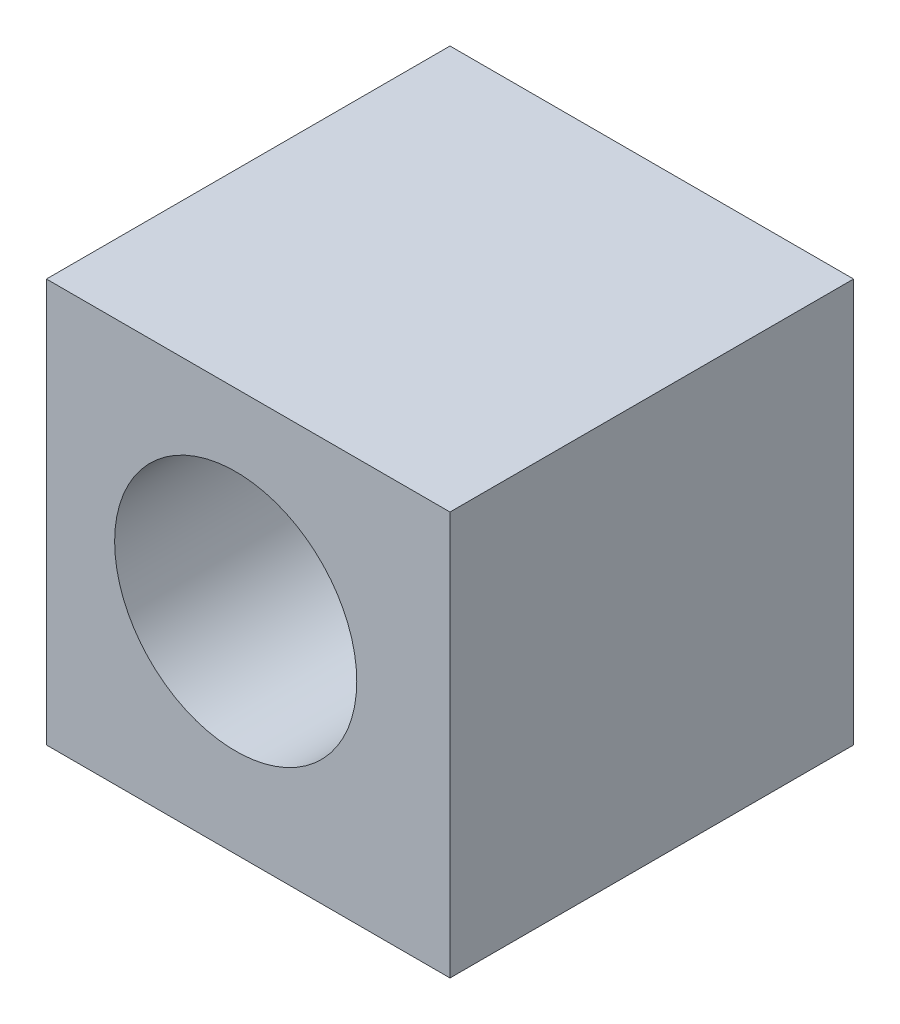
ISO-10303-21;
HEADER;
FILE_DESCRIPTION(('STEP AP214'),'2;1');
FILE_NAME('part.step','',(''),(''),'','','');
FILE_SCHEMA(('AUTOMOTIVE_DESIGN { 1 0 10303 214 1 1 1 1 }'));
ENDSEC;
DATA;
#1=APPLICATION_CONTEXT('core data for automotive mechanical design processes');
#2=APPLICATION_PROTOCOL_DEFINITION('international standard','automotive_design',2000,#1);
#3=PRODUCT_CONTEXT('',#1,'mechanical');
#4=PRODUCT('Part','Part','',(#3));
#5=PRODUCT_RELATED_PRODUCT_CATEGORY('part','',(#4));
#6=PRODUCT_DEFINITION_FORMATION('','',#4);
#7=PRODUCT_DEFINITION_CONTEXT('part definition',#1,'design');
#8=PRODUCT_DEFINITION('design','',#6,#7);
#9=PRODUCT_DEFINITION_SHAPE('','',#8);
#10=(LENGTH_UNIT() NAMED_UNIT(*) SI_UNIT(.MILLI.,.METRE.));
#11=(NAMED_UNIT(*) PLANE_ANGLE_UNIT() SI_UNIT($,.RADIAN.));
#12=(NAMED_UNIT(*) SI_UNIT($,.STERADIAN.) SOLID_ANGLE_UNIT());
#13=UNCERTAINTY_MEASURE_WITH_UNIT(LENGTH_MEASURE(1.E-05),#10,'distance_accuracy_value','');
#14=(GEOMETRIC_REPRESENTATION_CONTEXT(3) GLOBAL_UNCERTAINTY_ASSIGNED_CONTEXT((#13)) GLOBAL_UNIT_ASSIGNED_CONTEXT((#10,
#11,#12)) REPRESENTATION_CONTEXT('',''));
#15=CARTESIAN_POINT('',(0.,0.,0.));
#16=DIRECTION('',(0.,0.,1.));
#17=DIRECTION('',(1.,0.,0.));
#18=AXIS2_PLACEMENT_3D('',#15,#16,#17);
#19=CARTESIAN_POINT('',(0.,0.,50.));
#20=DIRECTION('',(1.,0.,0.));
#21=DIRECTION('',(0.,1.,0.));
#22=AXIS2_PLACEMENT_3D('',#19,#20,#21);
#23=PLANE('',#22);
#24=DIRECTION('',(0.,-1.,0.));
#25=VECTOR('',#24,1.);
#26=CARTESIAN_POINT('',(0.,0.,0.));
#27=LINE('',#26,#25);
#28=CARTESIAN_POINT('',(0.,50.,0.));
#29=VERTEX_POINT('',#28);
#30=CARTESIAN_POINT('',(0.,0.,0.));
#31=VERTEX_POINT('',#30);
#32=EDGE_CURVE('E104',#29,#31,#27,.T.);
#33=ORIENTED_EDGE('',*,*,#32,.T.);
#34=DIRECTION('',(0.,0.,-1.));
#35=VECTOR('',#34,1.);
#36=CARTESIAN_POINT('',(0.,0.,50.));
#37=LINE('',#36,#35);
#38=CARTESIAN_POINT('',(0.,0.,50.));
#39=VERTEX_POINT('',#38);
#40=EDGE_CURVE('E11',#39,#31,#37,.T.);
#41=ORIENTED_EDGE('',*,*,#40,.F.);
#42=DIRECTION('',(0.,-1.,0.));
#43=VECTOR('',#42,1.);
#44=CARTESIAN_POINT('',(0.,0.,50.));
#45=LINE('',#44,#43);
#46=CARTESIAN_POINT('',(0.,50.,50.));
#47=VERTEX_POINT('',#46);
#48=EDGE_CURVE('E92',#47,#39,#45,.T.);
#49=ORIENTED_EDGE('',*,*,#48,.F.);
#50=DIRECTION('',(0.,0.,-1.));
#51=VECTOR('',#50,1.);
#52=CARTESIAN_POINT('',(0.,50.,50.));
#53=LINE('',#52,#51);
#54=EDGE_CURVE('E100',#47,#29,#53,.T.);
#55=ORIENTED_EDGE('',*,*,#54,.T.);
#56=EDGE_LOOP('',(#33,#41,#49,#55));
#57=FACE_BOUND('',#56,.T.);
#58=ADVANCED_FACE('F41',(#57),#23,.F.);
#59=CARTESIAN_POINT('',(0.,0.,50.));
#60=DIRECTION('',(0.,1.,0.));
#61=DIRECTION('',(0.,0.,1.));
#62=AXIS2_PLACEMENT_3D('',#59,#60,#61);
#63=PLANE('',#62);
#64=DIRECTION('',(1.,0.,0.));
#65=VECTOR('',#64,1.);
#66=CARTESIAN_POINT('',(0.,0.,0.));
#67=LINE('',#66,#65);
#68=CARTESIAN_POINT('',(50.,0.,0.));
#69=VERTEX_POINT('',#68);
#70=EDGE_CURVE('E96',#31,#69,#67,.T.);
#71=ORIENTED_EDGE('',*,*,#70,.T.);
#72=DIRECTION('',(0.,0.,-1.));
#73=VECTOR('',#72,1.);
#74=CARTESIAN_POINT('',(50.,0.,50.));
#75=LINE('',#74,#73);
#76=CARTESIAN_POINT('',(50.,0.,50.));
#77=VERTEX_POINT('',#76);
#78=EDGE_CURVE('E49',#77,#69,#75,.T.);
#79=ORIENTED_EDGE('',*,*,#78,.F.);
#80=DIRECTION('',(1.,0.,0.));
#81=VECTOR('',#80,1.);
#82=CARTESIAN_POINT('',(0.,0.,50.));
#83=LINE('',#82,#81);
#84=EDGE_CURVE('E87',#39,#77,#83,.T.);
#85=ORIENTED_EDGE('',*,*,#84,.F.);
#86=ORIENTED_EDGE('',*,*,#40,.T.);
#87=EDGE_LOOP('',(#71,#79,#85,#86));
#88=FACE_BOUND('',#87,.T.);
#89=ADVANCED_FACE('F95',(#88),#63,.F.);
#90=CARTESIAN_POINT('',(50.,0.,50.));
#91=DIRECTION('',(-1.,0.,0.));
#92=DIRECTION('',(0.,-1.,0.));
#93=AXIS2_PLACEMENT_3D('',#90,#91,#92);
#94=PLANE('',#93);
#95=DIRECTION('',(0.,1.,0.));
#96=VECTOR('',#95,1.);
#97=CARTESIAN_POINT('',(50.,0.,0.));
#98=LINE('',#97,#96);
#99=CARTESIAN_POINT('',(50.,50.,0.));
#100=VERTEX_POINT('',#99);
#101=EDGE_CURVE('E74',#69,#100,#98,.T.);
#102=ORIENTED_EDGE('',*,*,#101,.T.);
#103=DIRECTION('',(0.,0.,-1.));
#104=VECTOR('',#103,1.);
#105=CARTESIAN_POINT('',(50.,50.,50.));
#106=LINE('',#105,#104);
#107=CARTESIAN_POINT('',(50.,50.,50.));
#108=VERTEX_POINT('',#107);
#109=EDGE_CURVE('E97',#108,#100,#106,.T.);
#110=ORIENTED_EDGE('',*,*,#109,.F.);
#111=DIRECTION('',(0.,1.,0.));
#112=VECTOR('',#111,1.);
#113=CARTESIAN_POINT('',(50.,0.,50.));
#114=LINE('',#113,#112);
#115=EDGE_CURVE('E90',#77,#108,#114,.T.);
#116=ORIENTED_EDGE('',*,*,#115,.F.);
#117=ORIENTED_EDGE('',*,*,#78,.T.);
#118=EDGE_LOOP('',(#102,#110,#116,#117));
#119=FACE_BOUND('',#118,.T.);
#120=ADVANCED_FACE('F98',(#119),#94,.F.);
#121=CARTESIAN_POINT('',(0.,50.,50.));
#122=DIRECTION('',(0.,-1.,0.));
#123=DIRECTION('',(0.,0.,-1.));
#124=AXIS2_PLACEMENT_3D('',#121,#122,#123);
#125=PLANE('',#124);
#126=DIRECTION('',(-1.,0.,0.));
#127=VECTOR('',#126,1.);
#128=CARTESIAN_POINT('',(0.,50.,0.));
#129=LINE('',#128,#127);
#130=EDGE_CURVE('E80',#100,#29,#129,.T.);
#131=ORIENTED_EDGE('',*,*,#130,.T.);
#132=ORIENTED_EDGE('',*,*,#54,.F.);
#133=DIRECTION('',(-1.,0.,0.));
#134=VECTOR('',#133,1.);
#135=CARTESIAN_POINT('',(0.,50.,50.));
#136=LINE('',#135,#134);
#137=EDGE_CURVE('E57',#108,#47,#136,.T.);
#138=ORIENTED_EDGE('',*,*,#137,.F.);
#139=ORIENTED_EDGE('',*,*,#109,.T.);
#140=EDGE_LOOP('',(#131,#132,#138,#139));
#141=FACE_BOUND('',#140,.T.);
#142=ADVANCED_FACE('F112',(#141),#125,.F.);
#143=CARTESIAN_POINT('',(0.,0.,50.));
#144=DIRECTION('',(0.,0.,-1.));
#145=DIRECTION('',(-1.,0.,0.));
#146=AXIS2_PLACEMENT_3D('',#143,#144,#145);
#147=PLANE('',#146);
#148=CARTESIAN_POINT('',(23.4486767167823,26.0630589929747,50.));
#149=DIRECTION('',(0.,0.,1.));
#150=DIRECTION('',(1.,0.,0.));
#151=AXIS2_PLACEMENT_3D('',#148,#149,#150);
#152=CIRCLE('',#151,15.);
#153=CARTESIAN_POINT('',(38.4486767167823,26.0630589929747,50.));
#154=VERTEX_POINT('',#153);
#155=EDGE_CURVE('E118',#154,#154,#152,.T.);
#156=ORIENTED_EDGE('',*,*,#155,.F.);
#157=EDGE_LOOP('',(#156));
#158=FACE_BOUND('',#157,.T.);
#159=ORIENTED_EDGE('',*,*,#48,.T.);
#160=ORIENTED_EDGE('',*,*,#84,.T.);
#161=ORIENTED_EDGE('',*,*,#115,.T.);
#162=ORIENTED_EDGE('',*,*,#137,.T.);
#163=EDGE_LOOP('',(#159,#160,#161,#162));
#164=FACE_BOUND('',#163,.T.);
#165=ADVANCED_FACE('F88',(#158,#164),#147,.F.);
#166=CARTESIAN_POINT('',(0.,0.,0.));
#167=DIRECTION('',(0.,0.,-1.));
#168=DIRECTION('',(-1.,0.,0.));
#169=AXIS2_PLACEMENT_3D('',#166,#167,#168);
#170=PLANE('',#169);
#171=CARTESIAN_POINT('',(23.4486767167823,26.0630589929747,0.));
#172=DIRECTION('',(0.,0.,1.));
#173=DIRECTION('',(1.,0.,0.));
#174=AXIS2_PLACEMENT_3D('',#171,#172,#173);
#175=CIRCLE('',#174,15.);
#176=CARTESIAN_POINT('',(38.4486767167823,26.0630589929747,0.));
#177=VERTEX_POINT('',#176);
#178=EDGE_CURVE('E107',#177,#177,#175,.T.);
#179=ORIENTED_EDGE('',*,*,#178,.T.);
#180=EDGE_LOOP('',(#179));
#181=FACE_BOUND('',#180,.T.);
#182=ORIENTED_EDGE('',*,*,#32,.F.);
#183=ORIENTED_EDGE('',*,*,#130,.F.);
#184=ORIENTED_EDGE('',*,*,#101,.F.);
#185=ORIENTED_EDGE('',*,*,#70,.F.);
#186=EDGE_LOOP('',(#182,#183,#184,#185));
#187=FACE_BOUND('',#186,.T.);
#188=ADVANCED_FACE('F115',(#181,#187),#170,.T.);
#189=CARTESIAN_POINT('',(23.4486767167823,26.0630589929747,0.));
#190=DIRECTION('',(0.,0.,1.));
#191=DIRECTION('',(1.,0.,0.));
#192=AXIS2_PLACEMENT_3D('',#189,#190,#191);
#193=CYLINDRICAL_SURFACE('',#192,15.);
#194=ORIENTED_EDGE('',*,*,#178,.F.);
#195=EDGE_LOOP('',(#194));
#196=FACE_BOUND('',#195,.T.);
#197=ORIENTED_EDGE('',*,*,#155,.T.);
#198=EDGE_LOOP('',(#197));
#199=FACE_BOUND('',#198,.T.);
#200=ADVANCED_FACE('F125',(#196,#199),#193,.F.);
#201=CLOSED_SHELL('',(#58,#89,#120,#142,#165,#188,#200));
#202=MANIFOLD_SOLID_BREP('B2',#201);
#203=ADVANCED_BREP_SHAPE_REPRESENTATION('',(#18,#202),#14);
#204=SHAPE_DEFINITION_REPRESENTATION(#9,#203);
ENDSEC;
END-ISO-10303-21;
